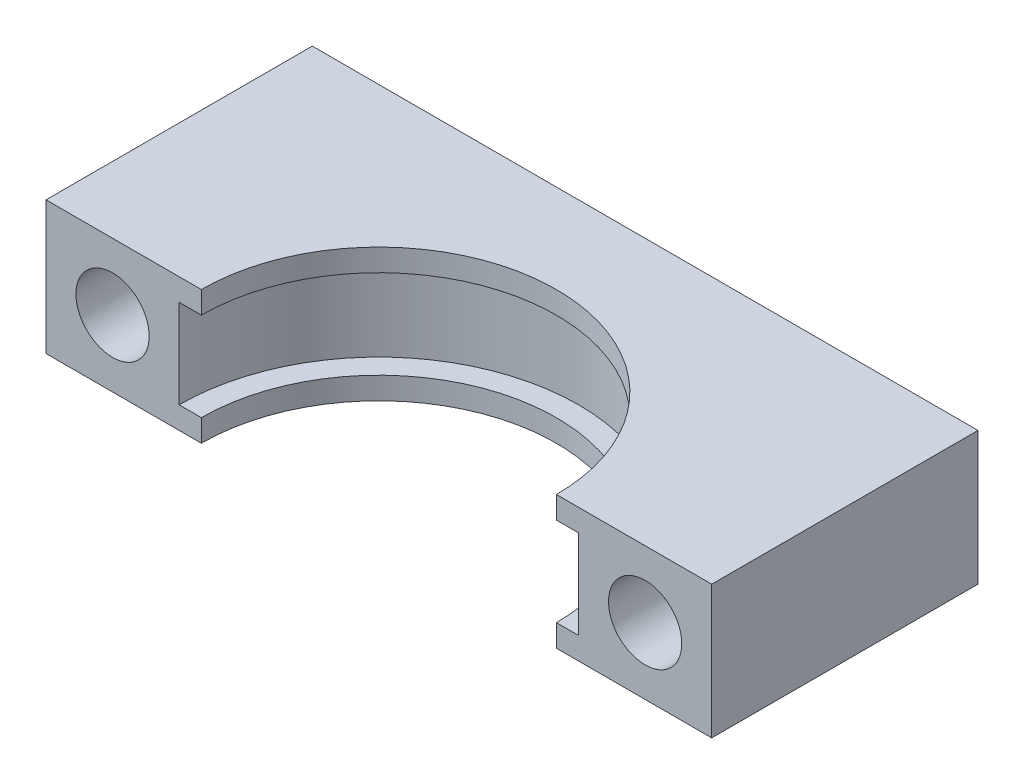
ISO-10303-21;
HEADER;
FILE_DESCRIPTION(('STEP AP214'),'2;1');
FILE_NAME('part.step','',(''),(''),'','','');
FILE_SCHEMA(('AUTOMOTIVE_DESIGN { 1 0 10303 214 1 1 1 1 }'));
ENDSEC;
DATA;
#1=APPLICATION_CONTEXT('core data for automotive mechanical design processes');
#2=APPLICATION_PROTOCOL_DEFINITION('international standard','automotive_design',2000,#1);
#3=PRODUCT_CONTEXT('',#1,'mechanical');
#4=PRODUCT('Part','Part','',(#3));
#5=PRODUCT_RELATED_PRODUCT_CATEGORY('part','',(#4));
#6=PRODUCT_DEFINITION_FORMATION('','',#4);
#7=PRODUCT_DEFINITION_CONTEXT('part definition',#1,'design');
#8=PRODUCT_DEFINITION('design','',#6,#7);
#9=PRODUCT_DEFINITION_SHAPE('','',#8);
#10=(LENGTH_UNIT() NAMED_UNIT(*) SI_UNIT(.MILLI.,.METRE.));
#11=(NAMED_UNIT(*) PLANE_ANGLE_UNIT() SI_UNIT($,.RADIAN.));
#12=(NAMED_UNIT(*) SI_UNIT($,.STERADIAN.) SOLID_ANGLE_UNIT());
#13=UNCERTAINTY_MEASURE_WITH_UNIT(LENGTH_MEASURE(1.E-05),#10,'distance_accuracy_value','');
#14=(GEOMETRIC_REPRESENTATION_CONTEXT(3) GLOBAL_UNCERTAINTY_ASSIGNED_CONTEXT((#13)) GLOBAL_UNIT_ASSIGNED_CONTEXT((#10,
#11,#12)) REPRESENTATION_CONTEXT('',''));
#15=CARTESIAN_POINT('',(0.,0.,0.));
#16=DIRECTION('',(0.,0.,1.));
#17=DIRECTION('',(1.,0.,0.));
#18=AXIS2_PLACEMENT_3D('',#15,#16,#17);
#19=CARTESIAN_POINT('',(-15.,6.,0.));
#20=DIRECTION('',(0.,0.,-1.));
#21=DIRECTION('',(-1.,0.,0.));
#22=AXIS2_PLACEMENT_3D('',#19,#20,#21);
#23=PLANE('',#22);
#24=CARTESIAN_POINT('',(12.,3.,0.));
#25=DIRECTION('',(0.,0.,-1.));
#26=DIRECTION('',(-1.,0.,0.));
#27=AXIS2_PLACEMENT_3D('',#24,#25,#26);
#28=CIRCLE('',#27,1.65);
#29=CARTESIAN_POINT('',(10.35,3.,0.));
#30=VERTEX_POINT('',#29);
#31=EDGE_CURVE('E267',#30,#30,#28,.F.);
#32=ORIENTED_EDGE('',*,*,#31,.F.);
#33=EDGE_LOOP('',(#32));
#34=FACE_BOUND('',#33,.T.);
#35=DIRECTION('',(0.,-1.,0.));
#36=VECTOR('',#35,1.);
#37=CARTESIAN_POINT('',(8.,0.,0.));
#38=LINE('',#37,#36);
#39=CARTESIAN_POINT('',(8.,5.,0.));
#40=VERTEX_POINT('',#39);
#41=CARTESIAN_POINT('',(8.,6.,0.));
#42=VERTEX_POINT('',#41);
#43=EDGE_CURVE('E181',#40,#42,#38,.F.);
#44=ORIENTED_EDGE('',*,*,#43,.F.);
#45=DIRECTION('',(-1.,0.,0.));
#46=VECTOR('',#45,1.);
#47=CARTESIAN_POINT('',(-15.,5.,0.));
#48=LINE('',#47,#46);
#49=CARTESIAN_POINT('',(9.,5.,0.));
#50=VERTEX_POINT('',#49);
#51=EDGE_CURVE('E11',#50,#40,#48,.T.);
#52=ORIENTED_EDGE('',*,*,#51,.F.);
#53=DIRECTION('',(0.,-1.,0.));
#54=VECTOR('',#53,1.);
#55=CARTESIAN_POINT('',(9.,0.,0.));
#56=LINE('',#55,#54);
#57=CARTESIAN_POINT('',(9.,1.,0.));
#58=VERTEX_POINT('',#57);
#59=EDGE_CURVE('E39',#58,#50,#56,.F.);
#60=ORIENTED_EDGE('',*,*,#59,.F.);
#61=DIRECTION('',(1.,0.,0.));
#62=VECTOR('',#61,1.);
#63=CARTESIAN_POINT('',(-15.,1.,0.));
#64=LINE('',#63,#62);
#65=CARTESIAN_POINT('',(8.,1.,0.));
#66=VERTEX_POINT('',#65);
#67=EDGE_CURVE('E134',#66,#58,#64,.T.);
#68=ORIENTED_EDGE('',*,*,#67,.F.);
#69=DIRECTION('',(0.,-1.,0.));
#70=VECTOR('',#69,1.);
#71=CARTESIAN_POINT('',(8.,0.,0.));
#72=LINE('',#71,#70);
#73=CARTESIAN_POINT('',(8.,0.,0.));
#74=VERTEX_POINT('',#73);
#75=EDGE_CURVE('E123',#74,#66,#72,.F.);
#76=ORIENTED_EDGE('',*,*,#75,.F.);
#77=DIRECTION('',(1.,0.,0.));
#78=VECTOR('',#77,1.);
#79=CARTESIAN_POINT('',(-15.,0.,0.));
#80=LINE('',#79,#78);
#81=CARTESIAN_POINT('',(15.,0.,0.));
#82=VERTEX_POINT('',#81);
#83=EDGE_CURVE('E82',#74,#82,#80,.T.);
#84=ORIENTED_EDGE('',*,*,#83,.T.);
#85=DIRECTION('',(0.,-1.,0.));
#86=VECTOR('',#85,1.);
#87=CARTESIAN_POINT('',(15.,6.,0.));
#88=LINE('',#87,#86);
#89=CARTESIAN_POINT('',(15.,6.,0.));
#90=VERTEX_POINT('',#89);
#91=EDGE_CURVE('E149',#90,#82,#88,.T.);
#92=ORIENTED_EDGE('',*,*,#91,.F.);
#93=DIRECTION('',(1.,0.,0.));
#94=VECTOR('',#93,1.);
#95=CARTESIAN_POINT('',(-15.,6.,0.));
#96=LINE('',#95,#94);
#97=EDGE_CURVE('E60',#42,#90,#96,.T.);
#98=ORIENTED_EDGE('',*,*,#97,.F.);
#99=EDGE_LOOP('',(#44,#52,#60,#68,#76,#84,#92,#98));
#100=FACE_BOUND('',#99,.T.);
#101=ADVANCED_FACE('F35',(#34,#100),#23,.F.);
#102=CARTESIAN_POINT('',(-12.,3.,0.));
#103=DIRECTION('',(0.,0.,-1.));
#104=DIRECTION('',(-1.,0.,0.));
#105=AXIS2_PLACEMENT_3D('',#102,#103,#104);
#106=CIRCLE('',#105,1.65);
#107=CARTESIAN_POINT('',(-13.65,3.,0.));
#108=VERTEX_POINT('',#107);
#109=EDGE_CURVE('E260',#108,#108,#106,.T.);
#110=ORIENTED_EDGE('',*,*,#109,.T.);
#111=EDGE_LOOP('',(#110));
#112=FACE_BOUND('',#111,.T.);
#113=DIRECTION('',(0.,-1.,0.));
#114=VECTOR('',#113,1.);
#115=CARTESIAN_POINT('',(-8.,0.,0.));
#116=LINE('',#115,#114);
#117=CARTESIAN_POINT('',(-8.,6.,0.));
#118=VERTEX_POINT('',#117);
#119=CARTESIAN_POINT('',(-8.,5.,0.));
#120=VERTEX_POINT('',#119);
#121=EDGE_CURVE('E135',#118,#120,#116,.T.);
#122=ORIENTED_EDGE('',*,*,#121,.F.);
#123=CARTESIAN_POINT('',(-15.,6.,0.));
#124=VERTEX_POINT('',#123);
#125=EDGE_CURVE('E152',#124,#118,#96,.T.);
#126=ORIENTED_EDGE('',*,*,#125,.F.);
#127=DIRECTION('',(0.,-1.,0.));
#128=VECTOR('',#127,1.);
#129=CARTESIAN_POINT('',(-15.,6.,0.));
#130=LINE('',#129,#128);
#131=CARTESIAN_POINT('',(-15.,0.,0.));
#132=VERTEX_POINT('',#131);
#133=EDGE_CURVE('E151',#124,#132,#130,.T.);
#134=ORIENTED_EDGE('',*,*,#133,.T.);
#135=CARTESIAN_POINT('',(-8.,0.,0.));
#136=VERTEX_POINT('',#135);
#137=EDGE_CURVE('E141',#132,#136,#80,.T.);
#138=ORIENTED_EDGE('',*,*,#137,.T.);
#139=DIRECTION('',(0.,-1.,0.));
#140=VECTOR('',#139,1.);
#141=CARTESIAN_POINT('',(-8.,0.,0.));
#142=LINE('',#141,#140);
#143=CARTESIAN_POINT('',(-8.,1.,0.));
#144=VERTEX_POINT('',#143);
#145=EDGE_CURVE('E51',#144,#136,#142,.T.);
#146=ORIENTED_EDGE('',*,*,#145,.F.);
#147=CARTESIAN_POINT('',(-9.,1.,0.));
#148=VERTEX_POINT('',#147);
#149=EDGE_CURVE('E160',#148,#144,#64,.T.);
#150=ORIENTED_EDGE('',*,*,#149,.F.);
#151=DIRECTION('',(0.,-1.,0.));
#152=VECTOR('',#151,1.);
#153=CARTESIAN_POINT('',(-9.,0.,0.));
#154=LINE('',#153,#152);
#155=CARTESIAN_POINT('',(-9.,5.,0.));
#156=VERTEX_POINT('',#155);
#157=EDGE_CURVE('E162',#156,#148,#154,.T.);
#158=ORIENTED_EDGE('',*,*,#157,.F.);
#159=EDGE_CURVE('E44',#120,#156,#48,.T.);
#160=ORIENTED_EDGE('',*,*,#159,.F.);
#161=EDGE_LOOP('',(#122,#126,#134,#138,#146,#150,#158,#160));
#162=FACE_BOUND('',#161,.T.);
#163=ADVANCED_FACE('F201',(#112,#162),#23,.F.);
#164=CARTESIAN_POINT('',(15.,6.,-12.));
#165=DIRECTION('',(-1.,0.,0.));
#166=DIRECTION('',(0.,0.,1.));
#167=AXIS2_PLACEMENT_3D('',#164,#165,#166);
#168=PLANE('',#167);
#169=DIRECTION('',(0.,0.,-1.));
#170=VECTOR('',#169,1.);
#171=CARTESIAN_POINT('',(15.,0.,-12.));
#172=LINE('',#171,#170);
#173=CARTESIAN_POINT('',(15.,0.,-12.));
#174=VERTEX_POINT('',#173);
#175=EDGE_CURVE('E140',#82,#174,#172,.T.);
#176=ORIENTED_EDGE('',*,*,#175,.T.);
#177=DIRECTION('',(0.,-1.,0.));
#178=VECTOR('',#177,1.);
#179=CARTESIAN_POINT('',(15.,6.,-12.));
#180=LINE('',#179,#178);
#181=CARTESIAN_POINT('',(15.,6.,-12.));
#182=VERTEX_POINT('',#181);
#183=EDGE_CURVE('E129',#182,#174,#180,.T.);
#184=ORIENTED_EDGE('',*,*,#183,.F.);
#185=DIRECTION('',(0.,0.,-1.));
#186=VECTOR('',#185,1.);
#187=CARTESIAN_POINT('',(15.,6.,-12.));
#188=LINE('',#187,#186);
#189=EDGE_CURVE('E144',#90,#182,#188,.T.);
#190=ORIENTED_EDGE('',*,*,#189,.F.);
#191=ORIENTED_EDGE('',*,*,#91,.T.);
#192=EDGE_LOOP('',(#176,#184,#190,#191));
#193=FACE_BOUND('',#192,.T.);
#194=ADVANCED_FACE('F37',(#193),#168,.F.);
#195=CARTESIAN_POINT('',(-15.,6.,-12.));
#196=DIRECTION('',(0.,0.,1.));
#197=DIRECTION('',(1.,0.,0.));
#198=AXIS2_PLACEMENT_3D('',#195,#196,#197);
#199=PLANE('',#198);
#200=CARTESIAN_POINT('',(-12.,3.,-12.));
#201=DIRECTION('',(0.,0.,1.));
#202=DIRECTION('',(1.,0.,0.));
#203=AXIS2_PLACEMENT_3D('',#200,#201,#202);
#204=CIRCLE('',#203,1.65);
#205=CARTESIAN_POINT('',(-10.35,3.,-12.));
#206=VERTEX_POINT('',#205);
#207=EDGE_CURVE('E257',#206,#206,#204,.T.);
#208=ORIENTED_EDGE('',*,*,#207,.T.);
#209=EDGE_LOOP('',(#208));
#210=FACE_BOUND('',#209,.T.);
#211=CARTESIAN_POINT('',(12.,3.,-12.));
#212=DIRECTION('',(0.,0.,-1.));
#213=DIRECTION('',(-1.,0.,0.));
#214=AXIS2_PLACEMENT_3D('',#211,#212,#213);
#215=CIRCLE('',#214,1.65);
#216=CARTESIAN_POINT('',(10.35,3.,-12.));
#217=VERTEX_POINT('',#216);
#218=EDGE_CURVE('E262',#217,#217,#215,.T.);
#219=ORIENTED_EDGE('',*,*,#218,.F.);
#220=EDGE_LOOP('',(#219));
#221=FACE_BOUND('',#220,.T.);
#222=DIRECTION('',(-1.,0.,0.));
#223=VECTOR('',#222,1.);
#224=CARTESIAN_POINT('',(-15.,0.,-12.));
#225=LINE('',#224,#223);
#226=CARTESIAN_POINT('',(-15.,0.,-12.));
#227=VERTEX_POINT('',#226);
#228=EDGE_CURVE('E145',#174,#227,#225,.T.);
#229=ORIENTED_EDGE('',*,*,#228,.T.);
#230=DIRECTION('',(0.,-1.,0.));
#231=VECTOR('',#230,1.);
#232=CARTESIAN_POINT('',(-15.,6.,-12.));
#233=LINE('',#232,#231);
#234=CARTESIAN_POINT('',(-15.,6.,-12.));
#235=VERTEX_POINT('',#234);
#236=EDGE_CURVE('E155',#235,#227,#233,.T.);
#237=ORIENTED_EDGE('',*,*,#236,.F.);
#238=DIRECTION('',(-1.,0.,0.));
#239=VECTOR('',#238,1.);
#240=CARTESIAN_POINT('',(-15.,6.,-12.));
#241=LINE('',#240,#239);
#242=EDGE_CURVE('E90',#182,#235,#241,.T.);
#243=ORIENTED_EDGE('',*,*,#242,.F.);
#244=ORIENTED_EDGE('',*,*,#183,.T.);
#245=EDGE_LOOP('',(#229,#237,#243,#244));
#246=FACE_BOUND('',#245,.T.);
#247=ADVANCED_FACE('F192',(#210,#221,#246),#199,.F.);
#248=CARTESIAN_POINT('',(-15.,6.,-12.));
#249=DIRECTION('',(1.,0.,0.));
#250=DIRECTION('',(0.,0.,-1.));
#251=AXIS2_PLACEMENT_3D('',#248,#249,#250);
#252=PLANE('',#251);
#253=DIRECTION('',(0.,0.,1.));
#254=VECTOR('',#253,1.);
#255=CARTESIAN_POINT('',(-15.,0.,-12.));
#256=LINE('',#255,#254);
#257=EDGE_CURVE('E142',#227,#132,#256,.T.);
#258=ORIENTED_EDGE('',*,*,#257,.T.);
#259=ORIENTED_EDGE('',*,*,#133,.F.);
#260=DIRECTION('',(0.,0.,1.));
#261=VECTOR('',#260,1.);
#262=CARTESIAN_POINT('',(-15.,6.,-12.));
#263=LINE('',#262,#261);
#264=EDGE_CURVE('E189',#235,#124,#263,.T.);
#265=ORIENTED_EDGE('',*,*,#264,.F.);
#266=ORIENTED_EDGE('',*,*,#236,.T.);
#267=EDGE_LOOP('',(#258,#259,#265,#266));
#268=FACE_BOUND('',#267,.T.);
#269=ADVANCED_FACE('F197',(#268),#252,.F.);
#270=CARTESIAN_POINT('',(0.,6.,0.));
#271=DIRECTION('',(0.,1.,0.));
#272=DIRECTION('',(0.,0.,1.));
#273=AXIS2_PLACEMENT_3D('',#270,#271,#272);
#274=PLANE('',#273);
#275=ORIENTED_EDGE('',*,*,#125,.T.);
#276=CARTESIAN_POINT('',(0.,6.,0.));
#277=DIRECTION('',(0.,1.,0.));
#278=DIRECTION('',(0.,0.,1.));
#279=AXIS2_PLACEMENT_3D('',#276,#277,#278);
#280=CIRCLE('',#279,8.);
#281=EDGE_CURVE('E128',#118,#42,#280,.F.);
#282=ORIENTED_EDGE('',*,*,#281,.T.);
#283=ORIENTED_EDGE('',*,*,#97,.T.);
#284=ORIENTED_EDGE('',*,*,#189,.T.);
#285=ORIENTED_EDGE('',*,*,#242,.T.);
#286=ORIENTED_EDGE('',*,*,#264,.T.);
#287=EDGE_LOOP('',(#275,#282,#283,#284,#285,#286));
#288=FACE_BOUND('',#287,.T.);
#289=ADVANCED_FACE('F204',(#288),#274,.T.);
#290=CARTESIAN_POINT('',(0.,0.,0.));
#291=DIRECTION('',(0.,1.,0.));
#292=DIRECTION('',(0.,0.,1.));
#293=AXIS2_PLACEMENT_3D('',#290,#291,#292);
#294=PLANE('',#293);
#295=CARTESIAN_POINT('',(0.,0.,0.));
#296=DIRECTION('',(0.,1.,0.));
#297=DIRECTION('',(0.,0.,1.));
#298=AXIS2_PLACEMENT_3D('',#295,#296,#297);
#299=CIRCLE('',#298,8.);
#300=EDGE_CURVE('E121',#136,#74,#299,.F.);
#301=ORIENTED_EDGE('',*,*,#300,.F.);
#302=ORIENTED_EDGE('',*,*,#137,.F.);
#303=ORIENTED_EDGE('',*,*,#257,.F.);
#304=ORIENTED_EDGE('',*,*,#228,.F.);
#305=ORIENTED_EDGE('',*,*,#175,.F.);
#306=ORIENTED_EDGE('',*,*,#83,.F.);
#307=EDGE_LOOP('',(#301,#302,#303,#304,#305,#306));
#308=FACE_BOUND('',#307,.T.);
#309=ADVANCED_FACE('F138',(#308),#294,.F.);
#310=CARTESIAN_POINT('',(0.,5.,0.));
#311=DIRECTION('',(0.,-1.,0.));
#312=DIRECTION('',(0.,0.,-1.));
#313=AXIS2_PLACEMENT_3D('',#310,#311,#312);
#314=PLANE('',#313);
#315=ORIENTED_EDGE('',*,*,#51,.T.);
#316=CARTESIAN_POINT('',(0.,5.,0.));
#317=DIRECTION('',(0.,-1.,0.));
#318=DIRECTION('',(0.,0.,-1.));
#319=AXIS2_PLACEMENT_3D('',#316,#317,#318);
#320=CIRCLE('',#319,8.);
#321=EDGE_CURVE('E179',#120,#40,#320,.T.);
#322=ORIENTED_EDGE('',*,*,#321,.F.);
#323=ORIENTED_EDGE('',*,*,#159,.T.);
#324=CARTESIAN_POINT('',(0.,5.,0.));
#325=DIRECTION('',(0.,-1.,0.));
#326=DIRECTION('',(0.,0.,-1.));
#327=AXIS2_PLACEMENT_3D('',#324,#325,#326);
#328=CIRCLE('',#327,9.);
#329=EDGE_CURVE('E173',#156,#50,#328,.T.);
#330=ORIENTED_EDGE('',*,*,#329,.T.);
#331=EDGE_LOOP('',(#315,#322,#323,#330));
#332=FACE_BOUND('',#331,.T.);
#333=ADVANCED_FACE('F177',(#332),#314,.T.);
#334=CARTESIAN_POINT('',(0.,0.,0.));
#335=DIRECTION('',(0.,-1.,0.));
#336=DIRECTION('',(0.,0.,-1.));
#337=AXIS2_PLACEMENT_3D('',#334,#335,#336);
#338=CYLINDRICAL_SURFACE('',#337,9.);
#339=ORIENTED_EDGE('',*,*,#59,.T.);
#340=ORIENTED_EDGE('',*,*,#329,.F.);
#341=ORIENTED_EDGE('',*,*,#157,.T.);
#342=CARTESIAN_POINT('',(0.,1.,0.));
#343=DIRECTION('',(0.,-1.,0.));
#344=DIRECTION('',(0.,0.,-1.));
#345=AXIS2_PLACEMENT_3D('',#342,#343,#344);
#346=CIRCLE('',#345,9.);
#347=EDGE_CURVE('E175',#148,#58,#346,.T.);
#348=ORIENTED_EDGE('',*,*,#347,.T.);
#349=EDGE_LOOP('',(#339,#340,#341,#348));
#350=FACE_BOUND('',#349,.T.);
#351=ADVANCED_FACE('F172',(#350),#338,.F.);
#352=CARTESIAN_POINT('',(0.,1.,0.));
#353=DIRECTION('',(0.,1.,0.));
#354=DIRECTION('',(0.,0.,1.));
#355=AXIS2_PLACEMENT_3D('',#352,#353,#354);
#356=PLANE('',#355);
#357=ORIENTED_EDGE('',*,*,#149,.T.);
#358=CARTESIAN_POINT('',(0.,1.,0.));
#359=DIRECTION('',(0.,-1.,0.));
#360=DIRECTION('',(0.,0.,-1.));
#361=AXIS2_PLACEMENT_3D('',#358,#359,#360);
#362=CIRCLE('',#361,8.);
#363=EDGE_CURVE('E270',#144,#66,#362,.T.);
#364=ORIENTED_EDGE('',*,*,#363,.T.);
#365=ORIENTED_EDGE('',*,*,#67,.T.);
#366=ORIENTED_EDGE('',*,*,#347,.F.);
#367=EDGE_LOOP('',(#357,#364,#365,#366));
#368=FACE_BOUND('',#367,.T.);
#369=ADVANCED_FACE('F236',(#368),#356,.T.);
#370=CARTESIAN_POINT('',(0.,0.,0.));
#371=DIRECTION('',(0.,-1.,0.));
#372=DIRECTION('',(0.,0.,-1.));
#373=AXIS2_PLACEMENT_3D('',#370,#371,#372);
#374=CYLINDRICAL_SURFACE('',#373,8.);
#375=ORIENTED_EDGE('',*,*,#43,.T.);
#376=ORIENTED_EDGE('',*,*,#281,.F.);
#377=ORIENTED_EDGE('',*,*,#121,.T.);
#378=ORIENTED_EDGE('',*,*,#321,.T.);
#379=EDGE_LOOP('',(#375,#376,#377,#378));
#380=FACE_BOUND('',#379,.T.);
#381=ADVANCED_FACE('F233',(#380),#374,.F.);
#382=CARTESIAN_POINT('',(0.,0.,0.));
#383=DIRECTION('',(0.,-1.,0.));
#384=DIRECTION('',(0.,0.,-1.));
#385=AXIS2_PLACEMENT_3D('',#382,#383,#384);
#386=CYLINDRICAL_SURFACE('',#385,8.);
#387=ORIENTED_EDGE('',*,*,#75,.T.);
#388=ORIENTED_EDGE('',*,*,#363,.F.);
#389=ORIENTED_EDGE('',*,*,#145,.T.);
#390=ORIENTED_EDGE('',*,*,#300,.T.);
#391=EDGE_LOOP('',(#387,#388,#389,#390));
#392=FACE_BOUND('',#391,.T.);
#393=ADVANCED_FACE('F122',(#392),#386,.F.);
#394=CARTESIAN_POINT('',(12.,3.,0.000999999999999265));
#395=DIRECTION('',(0.,0.,-1.));
#396=DIRECTION('',(-1.,0.,0.));
#397=AXIS2_PLACEMENT_3D('',#394,#395,#396);
#398=CYLINDRICAL_SURFACE('',#397,1.65);
#399=ORIENTED_EDGE('',*,*,#218,.T.);
#400=EDGE_LOOP('',(#399));
#401=FACE_BOUND('',#400,.T.);
#402=ORIENTED_EDGE('',*,*,#31,.T.);
#403=EDGE_LOOP('',(#402));
#404=FACE_BOUND('',#403,.T.);
#405=ADVANCED_FACE('F245',(#401,#404),#398,.F.);
#406=CARTESIAN_POINT('',(-12.,3.,0.000999999999999265));
#407=DIRECTION('',(0.,0.,-1.));
#408=DIRECTION('',(-1.,0.,0.));
#409=AXIS2_PLACEMENT_3D('',#406,#407,#408);
#410=CYLINDRICAL_SURFACE('',#409,1.65);
#411=ORIENTED_EDGE('',*,*,#207,.F.);
#412=EDGE_LOOP('',(#411));
#413=FACE_BOUND('',#412,.T.);
#414=ORIENTED_EDGE('',*,*,#109,.F.);
#415=EDGE_LOOP('',(#414));
#416=FACE_BOUND('',#415,.T.);
#417=ADVANCED_FACE('F248',(#413,#416),#410,.F.);
#418=CLOSED_SHELL('',(#101,#163,#194,#247,#269,#289,#309,#333,#351,#369,#381,#393,#405,#417));
#419=MANIFOLD_SOLID_BREP('B2',#418);
#420=ADVANCED_BREP_SHAPE_REPRESENTATION('',(#18,#419),#14);
#421=SHAPE_DEFINITION_REPRESENTATION(#9,#420);
ENDSEC;
END-ISO-10303-21;
